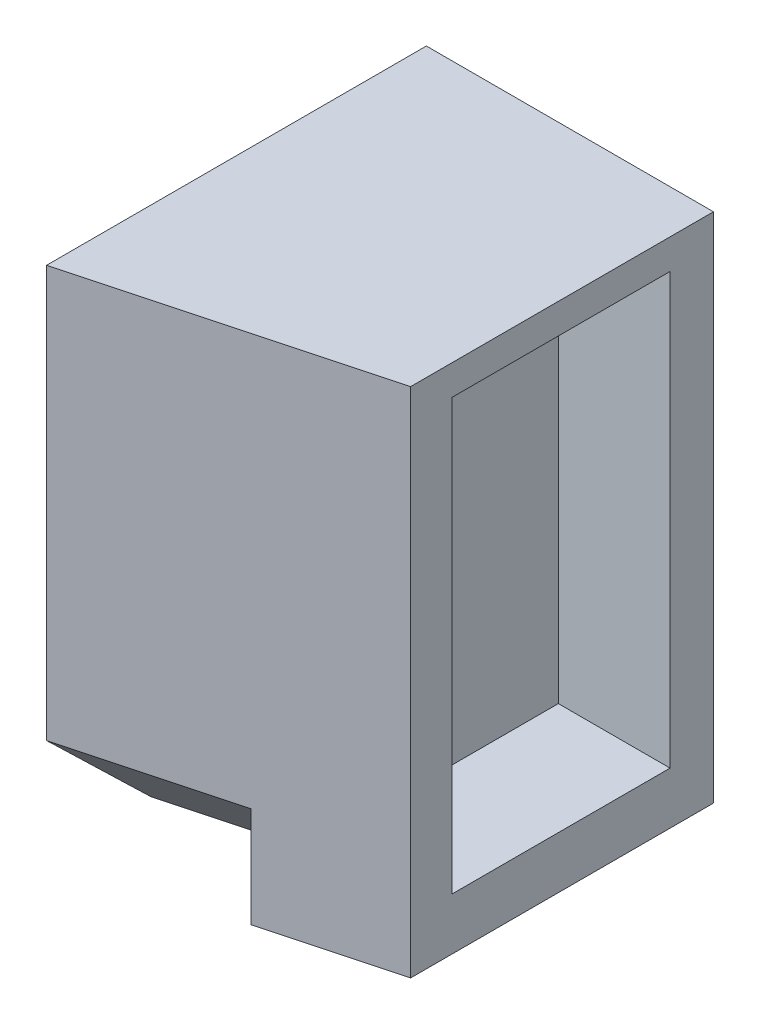
ISO-10303-21;
HEADER;
FILE_DESCRIPTION(('STEP AP214'),'2;1');
FILE_NAME('part.step','',(''),(''),'','','');
FILE_SCHEMA(('AUTOMOTIVE_DESIGN { 1 0 10303 214 1 1 1 1 }'));
ENDSEC;
DATA;
#1=APPLICATION_CONTEXT('core data for automotive mechanical design processes');
#2=APPLICATION_PROTOCOL_DEFINITION('international standard','automotive_design',2000,#1);
#3=PRODUCT_CONTEXT('',#1,'mechanical');
#4=PRODUCT('Part','Part','',(#3));
#5=PRODUCT_RELATED_PRODUCT_CATEGORY('part','',(#4));
#6=PRODUCT_DEFINITION_FORMATION('','',#4);
#7=PRODUCT_DEFINITION_CONTEXT('part definition',#1,'design');
#8=PRODUCT_DEFINITION('design','',#6,#7);
#9=PRODUCT_DEFINITION_SHAPE('','',#8);
#10=(LENGTH_UNIT() NAMED_UNIT(*) SI_UNIT(.MILLI.,.METRE.));
#11=(NAMED_UNIT(*) PLANE_ANGLE_UNIT() SI_UNIT($,.RADIAN.));
#12=(NAMED_UNIT(*) SI_UNIT($,.STERADIAN.) SOLID_ANGLE_UNIT());
#13=UNCERTAINTY_MEASURE_WITH_UNIT(LENGTH_MEASURE(1.E-05),#10,'distance_accuracy_value','');
#14=(GEOMETRIC_REPRESENTATION_CONTEXT(3) GLOBAL_UNCERTAINTY_ASSIGNED_CONTEXT((#13)) GLOBAL_UNIT_ASSIGNED_CONTEXT((#10,
#11,#12)) REPRESENTATION_CONTEXT('',''));
#15=CARTESIAN_POINT('',(0.,0.,0.));
#16=DIRECTION('',(0.,0.,1.));
#17=DIRECTION('',(1.,0.,0.));
#18=AXIS2_PLACEMENT_3D('',#15,#16,#17);
#19=CARTESIAN_POINT('',(0.,582.222563618504,0.));
#20=DIRECTION('',(1.,0.,0.));
#21=DIRECTION('',(0.,0.,-1.));
#22=AXIS2_PLACEMENT_3D('',#19,#20,#21);
#23=PLANE('',#22);
#24=DIRECTION('',(0.,0.,-1.));
#25=VECTOR('',#24,1.);
#26=CARTESIAN_POINT('',(0.,109.55,340.9));
#27=LINE('',#26,#25);
#28=CARTESIAN_POINT('',(0.,109.55,340.9));
#29=VERTEX_POINT('',#28);
#30=CARTESIAN_POINT('',(0.,109.55,90.9000000000001));
#31=VERTEX_POINT('',#30);
#32=EDGE_CURVE('E234',#29,#31,#27,.T.);
#33=ORIENTED_EDGE('',*,*,#32,.T.);
#34=DIRECTION('',(0.,1.,0.));
#35=VECTOR('',#34,1.);
#36=CARTESIAN_POINT('',(0.,309.55,90.9000000000001));
#37=LINE('',#36,#35);
#38=CARTESIAN_POINT('',(0.,309.55,90.9000000000001));
#39=VERTEX_POINT('',#38);
#40=EDGE_CURVE('E254',#31,#39,#37,.T.);
#41=ORIENTED_EDGE('',*,*,#40,.T.);
#42=DIRECTION('',(0.,0.,1.));
#43=VECTOR('',#42,1.);
#44=CARTESIAN_POINT('',(0.,309.55,340.9));
#45=LINE('',#44,#43);
#46=CARTESIAN_POINT('',(0.,309.55,340.9));
#47=VERTEX_POINT('',#46);
#48=EDGE_CURVE('E257',#39,#47,#45,.T.);
#49=ORIENTED_EDGE('',*,*,#48,.T.);
#50=DIRECTION('',(0.,-1.,0.));
#51=VECTOR('',#50,1.);
#52=CARTESIAN_POINT('',(0.,309.55,340.9));
#53=LINE('',#52,#51);
#54=EDGE_CURVE('E245',#47,#29,#53,.T.);
#55=ORIENTED_EDGE('',*,*,#54,.T.);
#56=EDGE_LOOP('',(#33,#41,#49,#55));
#57=FACE_BOUND('',#56,.T.);
#58=DIRECTION('',(0.,0.,1.));
#59=VECTOR('',#58,1.);
#60=CARTESIAN_POINT('',(0.,438.315,265.9));
#61=LINE('',#60,#59);
#62=CARTESIAN_POINT('',(0.,438.315,165.9));
#63=VERTEX_POINT('',#62);
#64=CARTESIAN_POINT('',(0.,438.315,265.9));
#65=VERTEX_POINT('',#64);
#66=EDGE_CURVE('E224',#63,#65,#61,.T.);
#67=ORIENTED_EDGE('',*,*,#66,.F.);
#68=DIRECTION('',(0.,-1.,0.));
#69=VECTOR('',#68,1.);
#70=CARTESIAN_POINT('',(0.,438.315,165.9));
#71=LINE('',#70,#69);
#72=CARTESIAN_POINT('',(0.,538.315,165.9));
#73=VERTEX_POINT('',#72);
#74=EDGE_CURVE('E207',#73,#63,#71,.T.);
#75=ORIENTED_EDGE('',*,*,#74,.F.);
#76=DIRECTION('',(0.,0.,-1.));
#77=VECTOR('',#76,1.);
#78=CARTESIAN_POINT('',(0.,538.315,265.9));
#79=LINE('',#78,#77);
#80=CARTESIAN_POINT('',(0.,538.315,265.9));
#81=VERTEX_POINT('',#80);
#82=EDGE_CURVE('E213',#81,#73,#79,.T.);
#83=ORIENTED_EDGE('',*,*,#82,.F.);
#84=DIRECTION('',(0.,1.,0.));
#85=VECTOR('',#84,1.);
#86=CARTESIAN_POINT('',(0.,438.315,265.9));
#87=LINE('',#86,#85);
#88=EDGE_CURVE('E227',#65,#81,#87,.T.);
#89=ORIENTED_EDGE('',*,*,#88,.F.);
#90=EDGE_LOOP('',(#67,#75,#83,#89));
#91=FACE_BOUND('',#90,.T.);
#92=DIRECTION('',(0.,-0.694746590606866,-0.719254596676403));
#93=VECTOR('',#92,1.);
#94=CARTESIAN_POINT('',(0.,124.383184423638,442.238880656475));
#95=LINE('',#94,#93);
#96=CARTESIAN_POINT('',(0.,114.3,431.8));
#97=VERTEX_POINT('',#96);
#98=CARTESIAN_POINT('',(0.,0.,313.467932579128));
#99=VERTEX_POINT('',#98);
#100=EDGE_CURVE('E192',#97,#99,#95,.T.);
#101=ORIENTED_EDGE('',*,*,#100,.F.);
#102=DIRECTION('',(0.,-1.,0.));
#103=VECTOR('',#102,1.);
#104=CARTESIAN_POINT('',(0.,582.222563618504,431.8));
#105=LINE('',#104,#103);
#106=CARTESIAN_POINT('',(0.,582.222563618504,431.8));
#107=VERTEX_POINT('',#106);
#108=EDGE_CURVE('E11',#107,#97,#105,.T.);
#109=ORIENTED_EDGE('',*,*,#108,.F.);
#110=DIRECTION('',(0.,0.,1.));
#111=VECTOR('',#110,1.);
#112=CARTESIAN_POINT('',(0.,582.222563618504,0.));
#113=LINE('',#112,#111);
#114=CARTESIAN_POINT('',(0.,582.222563618504,0.));
#115=VERTEX_POINT('',#114);
#116=EDGE_CURVE('E304',#115,#107,#113,.T.);
#117=ORIENTED_EDGE('',*,*,#116,.F.);
#118=DIRECTION('',(0.,-1.,0.));
#119=VECTOR('',#118,1.);
#120=CARTESIAN_POINT('',(0.,582.222563618504,0.));
#121=LINE('',#120,#119);
#122=CARTESIAN_POINT('',(0.,114.3,0.));
#123=VERTEX_POINT('',#122);
#124=EDGE_CURVE('E314',#115,#123,#121,.T.);
#125=ORIENTED_EDGE('',*,*,#124,.T.);
#126=DIRECTION('',(0.,0.707106781186548,-0.707106781186548));
#127=VECTOR('',#126,1.);
#128=CARTESIAN_POINT('',(0.,114.3,0.));
#129=LINE('',#128,#127);
#130=CARTESIAN_POINT('',(0.,0.,114.3));
#131=VERTEX_POINT('',#130);
#132=EDGE_CURVE('E196',#131,#123,#129,.T.);
#133=ORIENTED_EDGE('',*,*,#132,.F.);
#134=DIRECTION('',(0.,0.,1.));
#135=VECTOR('',#134,1.);
#136=CARTESIAN_POINT('',(0.,0.,0.));
#137=LINE('',#136,#135);
#138=EDGE_CURVE('E297',#131,#99,#137,.T.);
#139=ORIENTED_EDGE('',*,*,#138,.T.);
#140=EDGE_LOOP('',(#101,#109,#117,#125,#133,#139));
#141=FACE_BOUND('',#140,.T.);
#142=ADVANCED_FACE('F39',(#57,#91,#141),#23,.F.);
#143=CARTESIAN_POINT('',(0.,582.222563618504,431.8));
#144=DIRECTION('',(-0.258819045102518,0.,-0.965925826289069));
#145=DIRECTION('',(-0.965925826289069,0.,0.258819045102518));
#146=AXIS2_PLACEMENT_3D('',#143,#144,#145);
#147=PLANE('',#146);
#148=DIRECTION('',(-0.965925826289069,0.,0.258819045102518));
#149=VECTOR('',#148,1.);
#150=CARTESIAN_POINT('',(183.525906994923,114.3,382.624381430522));
#151=LINE('',#150,#149);
#152=CARTESIAN_POINT('',(183.525906994923,114.3,382.624381430522));
#153=VERTEX_POINT('',#152);
#154=EDGE_CURVE('E177',#153,#97,#151,.T.);
#155=ORIENTED_EDGE('',*,*,#154,.F.);
#156=DIRECTION('',(0.,-1.,0.));
#157=VECTOR('',#156,1.);
#158=CARTESIAN_POINT('',(183.525906994923,0.,382.624381430522));
#159=LINE('',#158,#157);
#160=CARTESIAN_POINT('',(183.525906994923,0.,382.624381430522));
#161=VERTEX_POINT('',#160);
#162=EDGE_CURVE('E181',#153,#161,#159,.T.);
#163=ORIENTED_EDGE('',*,*,#162,.T.);
#164=DIRECTION('',(0.965925826289069,0.,-0.258819045102518));
#165=VECTOR('',#164,1.);
#166=CARTESIAN_POINT('',(0.,0.,431.8));
#167=LINE('',#166,#165);
#168=CARTESIAN_POINT('',(326.398993940788,0.,344.341653163236));
#169=VERTEX_POINT('',#168);
#170=EDGE_CURVE('E317',#161,#169,#167,.T.);
#171=ORIENTED_EDGE('',*,*,#170,.T.);
#172=DIRECTION('',(0.,-1.,0.));
#173=VECTOR('',#172,1.);
#174=CARTESIAN_POINT('',(326.398993940788,582.222563618504,344.341653163236));
#175=LINE('',#174,#173);
#176=CARTESIAN_POINT('',(326.398993940788,582.222563618504,344.341653163236));
#177=VERTEX_POINT('',#176);
#178=EDGE_CURVE('E46',#177,#169,#175,.T.);
#179=ORIENTED_EDGE('',*,*,#178,.F.);
#180=DIRECTION('',(0.965925826289069,0.,-0.258819045102518));
#181=VECTOR('',#180,1.);
#182=CARTESIAN_POINT('',(0.,582.222563618504,431.8));
#183=LINE('',#182,#181);
#184=EDGE_CURVE('E307',#107,#177,#183,.T.);
#185=ORIENTED_EDGE('',*,*,#184,.F.);
#186=ORIENTED_EDGE('',*,*,#108,.T.);
#187=EDGE_LOOP('',(#155,#163,#171,#179,#185,#186));
#188=FACE_BOUND('',#187,.T.);
#189=ADVANCED_FACE('F189',(#188),#147,.F.);
#190=CARTESIAN_POINT('',(0.,0.,0.));
#191=DIRECTION('',(0.,-1.,0.));
#192=DIRECTION('',(0.,0.,-1.));
#193=AXIS2_PLACEMENT_3D('',#190,#191,#192);
#194=PLANE('',#193);
#195=DIRECTION('',(-0.258819045102518,0.,-0.965925826289069));
#196=VECTOR('',#195,1.);
#197=CARTESIAN_POINT('',(153.942890139705,0.,272.219059485681));
#198=LINE('',#197,#196);
#199=CARTESIAN_POINT('',(153.942890139705,0.,272.219059485681));
#200=VERTEX_POINT('',#199);
#201=EDGE_CURVE('E182',#161,#200,#198,.T.);
#202=ORIENTED_EDGE('',*,*,#201,.T.);
#203=DIRECTION('',(-0.965925826289069,0.,0.258819045102518));
#204=VECTOR('',#203,1.);
#205=CARTESIAN_POINT('',(153.942890139705,0.,272.219059485681));
#206=LINE('',#205,#204);
#207=EDGE_CURVE('E53',#200,#99,#206,.T.);
#208=ORIENTED_EDGE('',*,*,#207,.T.);
#209=ORIENTED_EDGE('',*,*,#138,.F.);
#210=DIRECTION('',(-1.,0.,0.));
#211=VECTOR('',#210,1.);
#212=CARTESIAN_POINT('',(172.,0.,114.3));
#213=LINE('',#212,#211);
#214=CARTESIAN_POINT('',(172.,0.,114.3));
#215=VERTEX_POINT('',#214);
#216=EDGE_CURVE('E202',#215,#131,#213,.T.);
#217=ORIENTED_EDGE('',*,*,#216,.F.);
#218=DIRECTION('',(0.,0.,1.));
#219=VECTOR('',#218,1.);
#220=CARTESIAN_POINT('',(172.,0.,114.3));
#221=LINE('',#220,#219);
#222=CARTESIAN_POINT('',(172.,0.,0.));
#223=VERTEX_POINT('',#222);
#224=EDGE_CURVE('E198',#223,#215,#221,.T.);
#225=ORIENTED_EDGE('',*,*,#224,.F.);
#226=DIRECTION('',(-1.,0.,0.));
#227=VECTOR('',#226,1.);
#228=CARTESIAN_POINT('',(326.398993940788,0.,0.));
#229=LINE('',#228,#227);
#230=CARTESIAN_POINT('',(326.398993940788,0.,0.));
#231=VERTEX_POINT('',#230);
#232=EDGE_CURVE('E308',#231,#223,#229,.T.);
#233=ORIENTED_EDGE('',*,*,#232,.F.);
#234=DIRECTION('',(0.,0.,-1.));
#235=VECTOR('',#234,1.);
#236=CARTESIAN_POINT('',(326.398993940788,0.,344.341653163236));
#237=LINE('',#236,#235);
#238=EDGE_CURVE('E319',#169,#231,#237,.T.);
#239=ORIENTED_EDGE('',*,*,#238,.F.);
#240=ORIENTED_EDGE('',*,*,#170,.F.);
#241=EDGE_LOOP('',(#202,#208,#209,#217,#225,#233,#239,#240));
#242=FACE_BOUND('',#241,.T.);
#243=ADVANCED_FACE('F336',(#242),#194,.T.);
#244=CARTESIAN_POINT('',(326.398993940788,582.222563618504,344.341653163236));
#245=DIRECTION('',(-1.,0.,0.));
#246=DIRECTION('',(0.,0.,1.));
#247=AXIS2_PLACEMENT_3D('',#244,#245,#246);
#248=PLANE('',#247);
#249=DIRECTION('',(0.,0.,-1.));
#250=VECTOR('',#249,1.);
#251=CARTESIAN_POINT('',(326.398993940788,59.1544754094797,49.3464453220122));
#252=LINE('',#251,#250);
#253=CARTESIAN_POINT('',(326.398993940788,59.1544754094797,296.996445322012));
#254=VERTEX_POINT('',#253);
#255=CARTESIAN_POINT('',(326.398993940788,59.1544754094797,49.3464453220122));
#256=VERTEX_POINT('',#255);
#257=EDGE_CURVE('E287',#254,#256,#252,.T.);
#258=ORIENTED_EDGE('',*,*,#257,.F.);
#259=DIRECTION('',(0.,-1.,0.));
#260=VECTOR('',#259,1.);
#261=CARTESIAN_POINT('',(326.398993940788,59.1544754094797,296.996445322012));
#262=LINE('',#261,#260);
#263=CARTESIAN_POINT('',(326.398993940788,548.10447540948,296.996445322012));
#264=VERTEX_POINT('',#263);
#265=EDGE_CURVE('E271',#264,#254,#262,.T.);
#266=ORIENTED_EDGE('',*,*,#265,.F.);
#267=DIRECTION('',(0.,0.,1.));
#268=VECTOR('',#267,1.);
#269=CARTESIAN_POINT('',(326.398993940788,548.10447540948,49.3464453220122));
#270=LINE('',#269,#268);
#271=CARTESIAN_POINT('',(326.398993940788,548.10447540948,49.3464453220122));
#272=VERTEX_POINT('',#271);
#273=EDGE_CURVE('E276',#272,#264,#270,.T.);
#274=ORIENTED_EDGE('',*,*,#273,.F.);
#275=DIRECTION('',(0.,1.,0.));
#276=VECTOR('',#275,1.);
#277=CARTESIAN_POINT('',(326.398993940788,59.1544754094797,49.3464453220122));
#278=LINE('',#277,#276);
#279=EDGE_CURVE('E290',#256,#272,#278,.T.);
#280=ORIENTED_EDGE('',*,*,#279,.F.);
#281=EDGE_LOOP('',(#258,#266,#274,#280));
#282=FACE_BOUND('',#281,.T.);
#283=ORIENTED_EDGE('',*,*,#238,.T.);
#284=DIRECTION('',(0.,-1.,0.));
#285=VECTOR('',#284,1.);
#286=CARTESIAN_POINT('',(326.398993940788,582.222563618504,0.));
#287=LINE('',#286,#285);
#288=CARTESIAN_POINT('',(326.398993940788,582.222563618504,0.));
#289=VERTEX_POINT('',#288);
#290=EDGE_CURVE('E325',#289,#231,#287,.T.);
#291=ORIENTED_EDGE('',*,*,#290,.F.);
#292=DIRECTION('',(0.,0.,-1.));
#293=VECTOR('',#292,1.);
#294=CARTESIAN_POINT('',(326.398993940788,582.222563618504,344.341653163236));
#295=LINE('',#294,#293);
#296=EDGE_CURVE('E310',#177,#289,#295,.T.);
#297=ORIENTED_EDGE('',*,*,#296,.F.);
#298=ORIENTED_EDGE('',*,*,#178,.T.);
#299=EDGE_LOOP('',(#283,#291,#297,#298));
#300=FACE_BOUND('',#299,.T.);
#301=ADVANCED_FACE('F332',(#282,#300),#248,.F.);
#302=CARTESIAN_POINT('',(326.398993940788,582.222563618504,0.));
#303=DIRECTION('',(0.,0.,1.));
#304=DIRECTION('',(1.,0.,0.));
#305=AXIS2_PLACEMENT_3D('',#302,#303,#304);
#306=PLANE('',#305);
#307=DIRECTION('',(0.,-1.,0.));
#308=VECTOR('',#307,1.);
#309=CARTESIAN_POINT('',(172.,0.,0.));
#310=LINE('',#309,#308);
#311=CARTESIAN_POINT('',(172.,114.3,0.));
#312=VERTEX_POINT('',#311);
#313=EDGE_CURVE('E61',#312,#223,#310,.T.);
#314=ORIENTED_EDGE('',*,*,#313,.F.);
#315=DIRECTION('',(-1.,0.,0.));
#316=VECTOR('',#315,1.);
#317=CARTESIAN_POINT('',(172.,114.3,0.));
#318=LINE('',#317,#316);
#319=EDGE_CURVE('E204',#312,#123,#318,.T.);
#320=ORIENTED_EDGE('',*,*,#319,.T.);
#321=ORIENTED_EDGE('',*,*,#124,.F.);
#322=DIRECTION('',(-1.,0.,0.));
#323=VECTOR('',#322,1.);
#324=CARTESIAN_POINT('',(326.398993940788,582.222563618504,0.));
#325=LINE('',#324,#323);
#326=EDGE_CURVE('E312',#289,#115,#325,.T.);
#327=ORIENTED_EDGE('',*,*,#326,.F.);
#328=ORIENTED_EDGE('',*,*,#290,.T.);
#329=ORIENTED_EDGE('',*,*,#232,.T.);
#330=EDGE_LOOP('',(#314,#320,#321,#327,#328,#329));
#331=FACE_BOUND('',#330,.T.);
#332=ADVANCED_FACE('F339',(#331),#306,.F.);
#333=CARTESIAN_POINT('',(0.,582.222563618504,0.));
#334=DIRECTION('',(0.,-1.,0.));
#335=DIRECTION('',(0.,0.,-1.));
#336=AXIS2_PLACEMENT_3D('',#333,#334,#335);
#337=PLANE('',#336);
#338=ORIENTED_EDGE('',*,*,#116,.T.);
#339=ORIENTED_EDGE('',*,*,#184,.T.);
#340=ORIENTED_EDGE('',*,*,#296,.T.);
#341=ORIENTED_EDGE('',*,*,#326,.T.);
#342=EDGE_LOOP('',(#338,#339,#340,#341));
#343=FACE_BOUND('',#342,.T.);
#344=ADVANCED_FACE('F344',(#343),#337,.F.);
#345=CARTESIAN_POINT('',(199.398993940788,59.1544754094797,296.996445322012));
#346=DIRECTION('',(0.,0.,1.));
#347=DIRECTION('',(1.,0.,0.));
#348=AXIS2_PLACEMENT_3D('',#345,#346,#347);
#349=PLANE('',#348);
#350=ORIENTED_EDGE('',*,*,#265,.T.);
#351=DIRECTION('',(1.,0.,0.));
#352=VECTOR('',#351,1.);
#353=CARTESIAN_POINT('',(199.398993940788,59.1544754094797,296.996445322012));
#354=LINE('',#353,#352);
#355=CARTESIAN_POINT('',(199.398993940788,59.1544754094797,296.996445322012));
#356=VERTEX_POINT('',#355);
#357=EDGE_CURVE('E285',#356,#254,#354,.T.);
#358=ORIENTED_EDGE('',*,*,#357,.F.);
#359=DIRECTION('',(0.,-1.,0.));
#360=VECTOR('',#359,1.);
#361=CARTESIAN_POINT('',(199.398993940788,59.1544754094797,296.996445322012));
#362=LINE('',#361,#360);
#363=CARTESIAN_POINT('',(199.398993940788,548.10447540948,296.996445322012));
#364=VERTEX_POINT('',#363);
#365=EDGE_CURVE('E272',#364,#356,#362,.T.);
#366=ORIENTED_EDGE('',*,*,#365,.F.);
#367=DIRECTION('',(1.,0.,0.));
#368=VECTOR('',#367,1.);
#369=CARTESIAN_POINT('',(199.398993940788,548.10447540948,296.996445322012));
#370=LINE('',#369,#368);
#371=EDGE_CURVE('E295',#364,#264,#370,.T.);
#372=ORIENTED_EDGE('',*,*,#371,.T.);
#373=EDGE_LOOP('',(#350,#358,#366,#372));
#374=FACE_BOUND('',#373,.T.);
#375=ADVANCED_FACE('F427',(#374),#349,.F.);
#376=CARTESIAN_POINT('',(199.398993940788,548.10447540948,49.3464453220122));
#377=DIRECTION('',(0.,1.,0.));
#378=DIRECTION('',(0.,0.,1.));
#379=AXIS2_PLACEMENT_3D('',#376,#377,#378);
#380=PLANE('',#379);
#381=ORIENTED_EDGE('',*,*,#273,.T.);
#382=ORIENTED_EDGE('',*,*,#371,.F.);
#383=DIRECTION('',(0.,0.,1.));
#384=VECTOR('',#383,1.);
#385=CARTESIAN_POINT('',(199.398993940788,548.10447540948,49.3464453220122));
#386=LINE('',#385,#384);
#387=CARTESIAN_POINT('',(199.398993940788,548.10447540948,49.3464453220122));
#388=VERTEX_POINT('',#387);
#389=EDGE_CURVE('E282',#388,#364,#386,.T.);
#390=ORIENTED_EDGE('',*,*,#389,.F.);
#391=DIRECTION('',(1.,0.,0.));
#392=VECTOR('',#391,1.);
#393=CARTESIAN_POINT('',(199.398993940788,548.10447540948,49.3464453220122));
#394=LINE('',#393,#392);
#395=EDGE_CURVE('E298',#388,#272,#394,.T.);
#396=ORIENTED_EDGE('',*,*,#395,.T.);
#397=EDGE_LOOP('',(#381,#382,#390,#396));
#398=FACE_BOUND('',#397,.T.);
#399=ADVANCED_FACE('F423',(#398),#380,.F.);
#400=CARTESIAN_POINT('',(199.398993940788,59.1544754094797,49.3464453220122));
#401=DIRECTION('',(0.,0.,-1.));
#402=DIRECTION('',(-1.,0.,0.));
#403=AXIS2_PLACEMENT_3D('',#400,#401,#402);
#404=PLANE('',#403);
#405=ORIENTED_EDGE('',*,*,#279,.T.);
#406=ORIENTED_EDGE('',*,*,#395,.F.);
#407=DIRECTION('',(0.,1.,0.));
#408=VECTOR('',#407,1.);
#409=CARTESIAN_POINT('',(199.398993940788,59.1544754094797,49.3464453220122));
#410=LINE('',#409,#408);
#411=CARTESIAN_POINT('',(199.398993940788,59.1544754094797,49.3464453220122));
#412=VERTEX_POINT('',#411);
#413=EDGE_CURVE('E279',#412,#388,#410,.T.);
#414=ORIENTED_EDGE('',*,*,#413,.F.);
#415=DIRECTION('',(1.,0.,0.));
#416=VECTOR('',#415,1.);
#417=CARTESIAN_POINT('',(199.398993940788,59.1544754094797,49.3464453220122));
#418=LINE('',#417,#416);
#419=EDGE_CURVE('E300',#412,#256,#418,.T.);
#420=ORIENTED_EDGE('',*,*,#419,.T.);
#421=EDGE_LOOP('',(#405,#406,#414,#420));
#422=FACE_BOUND('',#421,.T.);
#423=ADVANCED_FACE('F426',(#422),#404,.F.);
#424=CARTESIAN_POINT('',(199.398993940788,59.1544754094797,49.3464453220122));
#425=DIRECTION('',(0.,-1.,0.));
#426=DIRECTION('',(0.,0.,-1.));
#427=AXIS2_PLACEMENT_3D('',#424,#425,#426);
#428=PLANE('',#427);
#429=ORIENTED_EDGE('',*,*,#257,.T.);
#430=ORIENTED_EDGE('',*,*,#419,.F.);
#431=DIRECTION('',(0.,0.,-1.));
#432=VECTOR('',#431,1.);
#433=CARTESIAN_POINT('',(199.398993940788,59.1544754094797,49.3464453220122));
#434=LINE('',#433,#432);
#435=EDGE_CURVE('E275',#356,#412,#434,.T.);
#436=ORIENTED_EDGE('',*,*,#435,.F.);
#437=ORIENTED_EDGE('',*,*,#357,.T.);
#438=EDGE_LOOP('',(#429,#430,#436,#437));
#439=FACE_BOUND('',#438,.T.);
#440=ADVANCED_FACE('F421',(#439),#428,.F.);
#441=CARTESIAN_POINT('',(199.398993940788,0.,0.));
#442=DIRECTION('',(1.,0.,0.));
#443=DIRECTION('',(0.,0.,-1.));
#444=AXIS2_PLACEMENT_3D('',#441,#442,#443);
#445=PLANE('',#444);
#446=ORIENTED_EDGE('',*,*,#365,.T.);
#447=ORIENTED_EDGE('',*,*,#435,.T.);
#448=ORIENTED_EDGE('',*,*,#413,.T.);
#449=ORIENTED_EDGE('',*,*,#389,.T.);
#450=EDGE_LOOP('',(#446,#447,#448,#449));
#451=FACE_BOUND('',#450,.T.);
#452=ADVANCED_FACE('F417',(#451),#445,.T.);
#453=CARTESIAN_POINT('',(100.,109.55,340.9));
#454=DIRECTION('',(0.,1.,0.));
#455=DIRECTION('',(0.,0.,1.));
#456=AXIS2_PLACEMENT_3D('',#453,#454,#455);
#457=PLANE('',#456);
#458=ORIENTED_EDGE('',*,*,#32,.F.);
#459=DIRECTION('',(-1.,0.,0.));
#460=VECTOR('',#459,1.);
#461=CARTESIAN_POINT('',(100.,109.55,340.9));
#462=LINE('',#461,#460);
#463=CARTESIAN_POINT('',(100.,109.55,340.9));
#464=VERTEX_POINT('',#463);
#465=EDGE_CURVE('E251',#464,#29,#462,.T.);
#466=ORIENTED_EDGE('',*,*,#465,.F.);
#467=DIRECTION('',(0.,0.,-1.));
#468=VECTOR('',#467,1.);
#469=CARTESIAN_POINT('',(100.,109.55,340.9));
#470=LINE('',#469,#468);
#471=CARTESIAN_POINT('',(100.,109.55,90.9000000000001));
#472=VERTEX_POINT('',#471);
#473=EDGE_CURVE('E241',#464,#472,#470,.T.);
#474=ORIENTED_EDGE('',*,*,#473,.T.);
#475=DIRECTION('',(-1.,0.,0.));
#476=VECTOR('',#475,1.);
#477=CARTESIAN_POINT('',(100.,109.55,90.9000000000001));
#478=LINE('',#477,#476);
#479=EDGE_CURVE('E268',#472,#31,#478,.T.);
#480=ORIENTED_EDGE('',*,*,#479,.T.);
#481=EDGE_LOOP('',(#458,#466,#474,#480));
#482=FACE_BOUND('',#481,.T.);
#483=ADVANCED_FACE('F413',(#482),#457,.T.);
#484=CARTESIAN_POINT('',(100.,309.55,90.9000000000001));
#485=DIRECTION('',(0.,0.,1.));
#486=DIRECTION('',(1.,0.,0.));
#487=AXIS2_PLACEMENT_3D('',#484,#485,#486);
#488=PLANE('',#487);
#489=ORIENTED_EDGE('',*,*,#40,.F.);
#490=ORIENTED_EDGE('',*,*,#479,.F.);
#491=DIRECTION('',(0.,1.,0.));
#492=VECTOR('',#491,1.);
#493=CARTESIAN_POINT('',(100.,309.55,90.9000000000001));
#494=LINE('',#493,#492);
#495=CARTESIAN_POINT('',(100.,309.55,90.9000000000001));
#496=VERTEX_POINT('',#495);
#497=EDGE_CURVE('E244',#472,#496,#494,.T.);
#498=ORIENTED_EDGE('',*,*,#497,.T.);
#499=DIRECTION('',(-1.,0.,0.));
#500=VECTOR('',#499,1.);
#501=CARTESIAN_POINT('',(100.,309.55,90.9000000000001));
#502=LINE('',#501,#500);
#503=EDGE_CURVE('E266',#496,#39,#502,.T.);
#504=ORIENTED_EDGE('',*,*,#503,.T.);
#505=EDGE_LOOP('',(#489,#490,#498,#504));
#506=FACE_BOUND('',#505,.T.);
#507=ADVANCED_FACE('F409',(#506),#488,.T.);
#508=CARTESIAN_POINT('',(100.,309.55,340.9));
#509=DIRECTION('',(0.,-1.,0.));
#510=DIRECTION('',(0.,0.,-1.));
#511=AXIS2_PLACEMENT_3D('',#508,#509,#510);
#512=PLANE('',#511);
#513=ORIENTED_EDGE('',*,*,#48,.F.);
#514=ORIENTED_EDGE('',*,*,#503,.F.);
#515=DIRECTION('',(0.,0.,1.));
#516=VECTOR('',#515,1.);
#517=CARTESIAN_POINT('',(100.,309.55,340.9));
#518=LINE('',#517,#516);
#519=CARTESIAN_POINT('',(100.,309.55,340.9));
#520=VERTEX_POINT('',#519);
#521=EDGE_CURVE('E247',#496,#520,#518,.T.);
#522=ORIENTED_EDGE('',*,*,#521,.T.);
#523=DIRECTION('',(-1.,0.,0.));
#524=VECTOR('',#523,1.);
#525=CARTESIAN_POINT('',(100.,309.55,340.9));
#526=LINE('',#525,#524);
#527=EDGE_CURVE('E264',#520,#47,#526,.T.);
#528=ORIENTED_EDGE('',*,*,#527,.T.);
#529=EDGE_LOOP('',(#513,#514,#522,#528));
#530=FACE_BOUND('',#529,.T.);
#531=ADVANCED_FACE('F405',(#530),#512,.T.);
#532=CARTESIAN_POINT('',(100.,309.55,340.9));
#533=DIRECTION('',(0.,0.,-1.));
#534=DIRECTION('',(-1.,0.,0.));
#535=AXIS2_PLACEMENT_3D('',#532,#533,#534);
#536=PLANE('',#535);
#537=ORIENTED_EDGE('',*,*,#54,.F.);
#538=ORIENTED_EDGE('',*,*,#527,.F.);
#539=DIRECTION('',(0.,-1.,0.));
#540=VECTOR('',#539,1.);
#541=CARTESIAN_POINT('',(100.,309.55,340.9));
#542=LINE('',#541,#540);
#543=EDGE_CURVE('E249',#520,#464,#542,.T.);
#544=ORIENTED_EDGE('',*,*,#543,.T.);
#545=ORIENTED_EDGE('',*,*,#465,.T.);
#546=EDGE_LOOP('',(#537,#538,#544,#545));
#547=FACE_BOUND('',#546,.T.);
#548=ADVANCED_FACE('F401',(#547),#536,.T.);
#549=CARTESIAN_POINT('',(100.,0.,0.));
#550=DIRECTION('',(-1.,0.,0.));
#551=DIRECTION('',(0.,0.,1.));
#552=AXIS2_PLACEMENT_3D('',#549,#550,#551);
#553=PLANE('',#552);
#554=ORIENTED_EDGE('',*,*,#473,.F.);
#555=ORIENTED_EDGE('',*,*,#543,.F.);
#556=ORIENTED_EDGE('',*,*,#521,.F.);
#557=ORIENTED_EDGE('',*,*,#497,.F.);
#558=EDGE_LOOP('',(#554,#555,#556,#557));
#559=FACE_BOUND('',#558,.T.);
#560=ADVANCED_FACE('F398',(#559),#553,.T.);
#561=CARTESIAN_POINT('',(100.,438.315,165.9));
#562=DIRECTION('',(0.,0.,-1.));
#563=DIRECTION('',(-1.,0.,0.));
#564=AXIS2_PLACEMENT_3D('',#561,#562,#563);
#565=PLANE('',#564);
#566=ORIENTED_EDGE('',*,*,#74,.T.);
#567=DIRECTION('',(-1.,0.,0.));
#568=VECTOR('',#567,1.);
#569=CARTESIAN_POINT('',(100.,438.315,165.9));
#570=LINE('',#569,#568);
#571=CARTESIAN_POINT('',(100.,438.315,165.9));
#572=VERTEX_POINT('',#571);
#573=EDGE_CURVE('E222',#572,#63,#570,.T.);
#574=ORIENTED_EDGE('',*,*,#573,.F.);
#575=DIRECTION('',(0.,-1.,0.));
#576=VECTOR('',#575,1.);
#577=CARTESIAN_POINT('',(100.,438.315,165.9));
#578=LINE('',#577,#576);
#579=CARTESIAN_POINT('',(100.,538.315,165.9));
#580=VERTEX_POINT('',#579);
#581=EDGE_CURVE('E209',#580,#572,#578,.T.);
#582=ORIENTED_EDGE('',*,*,#581,.F.);
#583=DIRECTION('',(-1.,0.,0.));
#584=VECTOR('',#583,1.);
#585=CARTESIAN_POINT('',(100.,538.315,165.9));
#586=LINE('',#585,#584);
#587=EDGE_CURVE('E232',#580,#73,#586,.T.);
#588=ORIENTED_EDGE('',*,*,#587,.T.);
#589=EDGE_LOOP('',(#566,#574,#582,#588));
#590=FACE_BOUND('',#589,.T.);
#591=ADVANCED_FACE('F378',(#590),#565,.F.);
#592=CARTESIAN_POINT('',(100.,538.315,265.9));
#593=DIRECTION('',(0.,1.,0.));
#594=DIRECTION('',(0.,0.,1.));
#595=AXIS2_PLACEMENT_3D('',#592,#593,#594);
#596=PLANE('',#595);
#597=ORIENTED_EDGE('',*,*,#82,.T.);
#598=ORIENTED_EDGE('',*,*,#587,.F.);
#599=DIRECTION('',(0.,0.,-1.));
#600=VECTOR('',#599,1.);
#601=CARTESIAN_POINT('',(100.,538.315,265.9));
#602=LINE('',#601,#600);
#603=CARTESIAN_POINT('',(100.,538.315,265.9));
#604=VERTEX_POINT('',#603);
#605=EDGE_CURVE('E219',#604,#580,#602,.T.);
#606=ORIENTED_EDGE('',*,*,#605,.F.);
#607=DIRECTION('',(-1.,0.,0.));
#608=VECTOR('',#607,1.);
#609=CARTESIAN_POINT('',(100.,538.315,265.9));
#610=LINE('',#609,#608);
#611=EDGE_CURVE('E235',#604,#81,#610,.T.);
#612=ORIENTED_EDGE('',*,*,#611,.T.);
#613=EDGE_LOOP('',(#597,#598,#606,#612));
#614=FACE_BOUND('',#613,.T.);
#615=ADVANCED_FACE('F381',(#614),#596,.F.);
#616=CARTESIAN_POINT('',(100.,438.315,265.9));
#617=DIRECTION('',(0.,0.,1.));
#618=DIRECTION('',(1.,0.,0.));
#619=AXIS2_PLACEMENT_3D('',#616,#617,#618);
#620=PLANE('',#619);
#621=ORIENTED_EDGE('',*,*,#88,.T.);
#622=ORIENTED_EDGE('',*,*,#611,.F.);
#623=DIRECTION('',(0.,1.,0.));
#624=VECTOR('',#623,1.);
#625=CARTESIAN_POINT('',(100.,438.315,265.9));
#626=LINE('',#625,#624);
#627=CARTESIAN_POINT('',(100.,438.315,265.9));
#628=VERTEX_POINT('',#627);
#629=EDGE_CURVE('E216',#628,#604,#626,.T.);
#630=ORIENTED_EDGE('',*,*,#629,.F.);
#631=DIRECTION('',(-1.,0.,0.));
#632=VECTOR('',#631,1.);
#633=CARTESIAN_POINT('',(100.,438.315,265.9));
#634=LINE('',#633,#632);
#635=EDGE_CURVE('E237',#628,#65,#634,.T.);
#636=ORIENTED_EDGE('',*,*,#635,.T.);
#637=EDGE_LOOP('',(#621,#622,#630,#636));
#638=FACE_BOUND('',#637,.T.);
#639=ADVANCED_FACE('F383',(#638),#620,.F.);
#640=CARTESIAN_POINT('',(100.,438.315,265.9));
#641=DIRECTION('',(0.,-1.,0.));
#642=DIRECTION('',(0.,0.,-1.));
#643=AXIS2_PLACEMENT_3D('',#640,#641,#642);
#644=PLANE('',#643);
#645=ORIENTED_EDGE('',*,*,#66,.T.);
#646=ORIENTED_EDGE('',*,*,#635,.F.);
#647=DIRECTION('',(0.,0.,1.));
#648=VECTOR('',#647,1.);
#649=CARTESIAN_POINT('',(100.,438.315,265.9));
#650=LINE('',#649,#648);
#651=EDGE_CURVE('E212',#572,#628,#650,.T.);
#652=ORIENTED_EDGE('',*,*,#651,.F.);
#653=ORIENTED_EDGE('',*,*,#573,.T.);
#654=EDGE_LOOP('',(#645,#646,#652,#653));
#655=FACE_BOUND('',#654,.T.);
#656=ADVANCED_FACE('F373',(#655),#644,.F.);
#657=CARTESIAN_POINT('',(100.,0.,0.));
#658=DIRECTION('',(-1.,0.,0.));
#659=DIRECTION('',(0.,0.,1.));
#660=AXIS2_PLACEMENT_3D('',#657,#658,#659);
#661=PLANE('',#660);
#662=ORIENTED_EDGE('',*,*,#581,.T.);
#663=ORIENTED_EDGE('',*,*,#651,.T.);
#664=ORIENTED_EDGE('',*,*,#629,.T.);
#665=ORIENTED_EDGE('',*,*,#605,.T.);
#666=EDGE_LOOP('',(#662,#663,#664,#665));
#667=FACE_BOUND('',#666,.T.);
#668=ADVANCED_FACE('F360',(#667),#661,.T.);
#669=CARTESIAN_POINT('',(172.,114.3,0.));
#670=DIRECTION('',(0.,0.707106781186548,0.707106781186548));
#671=DIRECTION('',(0.,-0.707106781186548,0.707106781186548));
#672=AXIS2_PLACEMENT_3D('',#669,#670,#671);
#673=PLANE('',#672);
#674=ORIENTED_EDGE('',*,*,#132,.T.);
#675=ORIENTED_EDGE('',*,*,#319,.F.);
#676=DIRECTION('',(0.,0.707106781186548,-0.707106781186548));
#677=VECTOR('',#676,1.);
#678=CARTESIAN_POINT('',(172.,114.3,0.));
#679=LINE('',#678,#677);
#680=EDGE_CURVE('E200',#215,#312,#679,.T.);
#681=ORIENTED_EDGE('',*,*,#680,.F.);
#682=ORIENTED_EDGE('',*,*,#216,.T.);
#683=EDGE_LOOP('',(#674,#675,#681,#682));
#684=FACE_BOUND('',#683,.T.);
#685=ADVANCED_FACE('F351',(#684),#673,.F.);
#686=CARTESIAN_POINT('',(172.,0.,0.));
#687=DIRECTION('',(-1.,0.,0.));
#688=DIRECTION('',(0.,0.,1.));
#689=AXIS2_PLACEMENT_3D('',#686,#687,#688);
#690=PLANE('',#689);
#691=ORIENTED_EDGE('',*,*,#313,.T.);
#692=ORIENTED_EDGE('',*,*,#224,.T.);
#693=ORIENTED_EDGE('',*,*,#680,.T.);
#694=EDGE_LOOP('',(#691,#692,#693));
#695=FACE_BOUND('',#694,.T.);
#696=ADVANCED_FACE('F352',(#695),#690,.T.);
#697=CARTESIAN_POINT('',(183.525906994923,114.3,382.624381430522));
#698=DIRECTION('',(0.183012701892217,-0.707106781186547,0.68301270189222));
#699=DIRECTION('',(0.,-0.694746590606866,-0.719254596676403));
#700=AXIS2_PLACEMENT_3D('',#697,#698,#699);
#701=PLANE('',#700);
#702=ORIENTED_EDGE('',*,*,#100,.T.);
#703=ORIENTED_EDGE('',*,*,#207,.F.);
#704=DIRECTION('',(0.183012701892217,0.707106781186548,0.68301270189222));
#705=VECTOR('',#704,1.);
#706=CARTESIAN_POINT('',(183.525906994923,114.3,382.624381430522));
#707=LINE('',#706,#705);
#708=EDGE_CURVE('E173',#200,#153,#707,.T.);
#709=ORIENTED_EDGE('',*,*,#708,.T.);
#710=ORIENTED_EDGE('',*,*,#154,.T.);
#711=EDGE_LOOP('',(#702,#703,#709,#710));
#712=FACE_BOUND('',#711,.T.);
#713=ADVANCED_FACE('F175',(#712),#701,.T.);
#714=CARTESIAN_POINT('',(75.5759069949242,0.,-20.2505032465393));
#715=DIRECTION('',(-0.965925826289069,0.,0.258819045102518));
#716=DIRECTION('',(0.258819045102518,0.,0.965925826289069));
#717=AXIS2_PLACEMENT_3D('',#714,#715,#716);
#718=PLANE('',#717);
#719=ORIENTED_EDGE('',*,*,#201,.F.);
#720=ORIENTED_EDGE('',*,*,#162,.F.);
#721=ORIENTED_EDGE('',*,*,#708,.F.);
#722=EDGE_LOOP('',(#719,#720,#721));
#723=FACE_BOUND('',#722,.T.);
#724=ADVANCED_FACE('F185',(#723),#718,.T.);
#725=CLOSED_SHELL('',(#142,#189,#243,#301,#332,#344,#375,#399,#423,#440,#452,#483,#507,#531,
#548,#560,#591,#615,#639,#656,#668,#685,#696,#713,#724));
#726=MANIFOLD_SOLID_BREP('B2',#725);
#727=ADVANCED_BREP_SHAPE_REPRESENTATION('',(#18,#726),#14);
#728=SHAPE_DEFINITION_REPRESENTATION(#9,#727);
ENDSEC;
END-ISO-10303-21;
